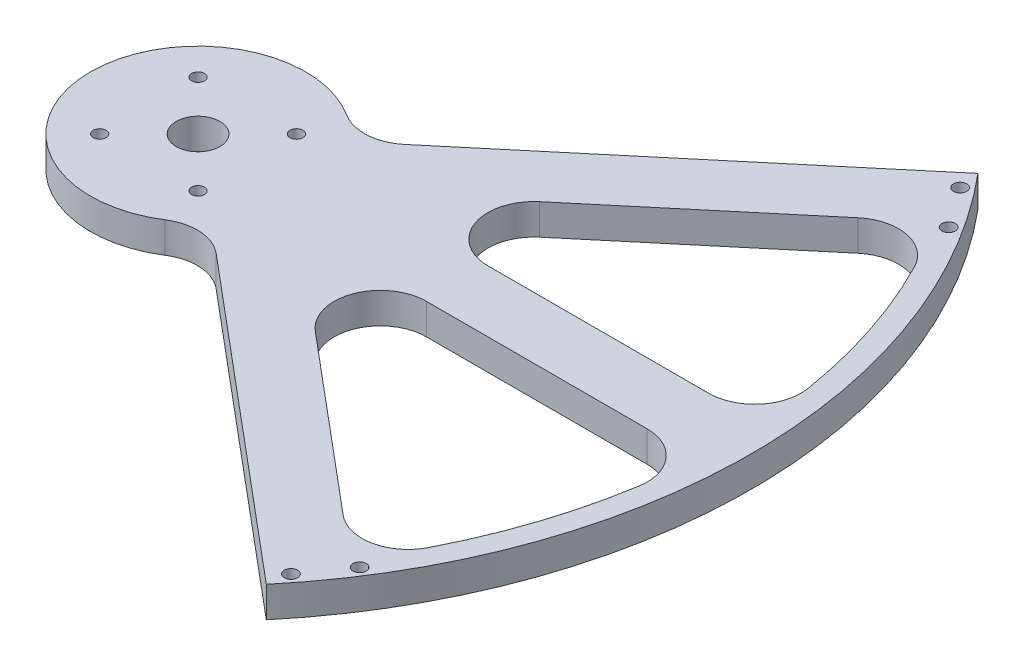
ISO-10303-21;
HEADER;
FILE_DESCRIPTION(('STEP AP214'),'2;1');
FILE_NAME('part.step','',(''),(''),'','','');
FILE_SCHEMA(('AUTOMOTIVE_DESIGN { 1 0 10303 214 1 1 1 1 }'));
ENDSEC;
DATA;
#1=APPLICATION_CONTEXT('core data for automotive mechanical design processes');
#2=APPLICATION_PROTOCOL_DEFINITION('international standard','automotive_design',2000,#1);
#3=PRODUCT_CONTEXT('',#1,'mechanical');
#4=PRODUCT('Part','Part','',(#3));
#5=PRODUCT_RELATED_PRODUCT_CATEGORY('part','',(#4));
#6=PRODUCT_DEFINITION_FORMATION('','',#4);
#7=PRODUCT_DEFINITION_CONTEXT('part definition',#1,'design');
#8=PRODUCT_DEFINITION('design','',#6,#7);
#9=PRODUCT_DEFINITION_SHAPE('','',#8);
#10=(LENGTH_UNIT() NAMED_UNIT(*) SI_UNIT(.MILLI.,.METRE.));
#11=(NAMED_UNIT(*) PLANE_ANGLE_UNIT() SI_UNIT($,.RADIAN.));
#12=(NAMED_UNIT(*) SI_UNIT($,.STERADIAN.) SOLID_ANGLE_UNIT());
#13=UNCERTAINTY_MEASURE_WITH_UNIT(LENGTH_MEASURE(1.E-05),#10,'distance_accuracy_value','');
#14=(GEOMETRIC_REPRESENTATION_CONTEXT(3) GLOBAL_UNCERTAINTY_ASSIGNED_CONTEXT((#13)) GLOBAL_UNIT_ASSIGNED_CONTEXT((#10,
#11,#12)) REPRESENTATION_CONTEXT('',''));
#15=CARTESIAN_POINT('',(0.,0.,0.));
#16=DIRECTION('',(0.,0.,1.));
#17=DIRECTION('',(1.,0.,0.));
#18=AXIS2_PLACEMENT_3D('',#15,#16,#17);
#19=CARTESIAN_POINT('',(74.9376609731613,11.468749366838,147.92195891865));
#20=DIRECTION('',(0.642787609686534,0.,-0.766044443118982));
#21=DIRECTION('',(-0.766044443118982,0.,-0.642787609686534));
#22=AXIS2_PLACEMENT_3D('',#19,#20,#21);
#23=PLANE('',#22);
#24=DIRECTION('',(0.,-1.,0.));
#25=VECTOR('',#24,1.);
#26=CARTESIAN_POINT('',(74.9376609731613,11.468749366838,147.92195891865));
#27=LINE('',#26,#25);
#28=CARTESIAN_POINT('',(74.9376609731613,11.468749366838,147.92195891865));
#29=VERTEX_POINT('',#28);
#30=CARTESIAN_POINT('',(74.9376609731613,1.46874936683801,147.92195891865));
#31=VERTEX_POINT('',#30);
#32=EDGE_CURVE('E196',#29,#31,#27,.T.);
#33=ORIENTED_EDGE('',*,*,#32,.F.);
#34=DIRECTION('',(0.766044443118982,0.,0.642787609686535));
#35=VECTOR('',#34,1.);
#36=CARTESIAN_POINT('',(69.5753498713284,11.468749366838,143.422445650844));
#37=LINE('',#36,#35);
#38=CARTESIAN_POINT('',(-26.412347572315,11.468749366838,62.8792041283273));
#39=VERTEX_POINT('',#38);
#40=EDGE_CURVE('E175',#39,#29,#37,.T.);
#41=ORIENTED_EDGE('',*,*,#40,.F.);
#42=DIRECTION('',(0.,1.,0.));
#43=VECTOR('',#42,1.);
#44=CARTESIAN_POINT('',(-26.412347572315,1.46874936683801,62.8792041283274));
#45=LINE('',#44,#43);
#46=CARTESIAN_POINT('',(-26.412347572315,1.46874936683801,62.8792041283274));
#47=VERTEX_POINT('',#46);
#48=EDGE_CURVE('E259',#39,#47,#45,.F.);
#49=ORIENTED_EDGE('',*,*,#48,.T.);
#50=DIRECTION('',(0.766044443118982,0.,0.642787609686534));
#51=VECTOR('',#50,1.);
#52=CARTESIAN_POINT('',(74.9376609731613,1.46874936683801,147.92195891865));
#53=LINE('',#52,#51);
#54=EDGE_CURVE('E204',#47,#31,#53,.T.);
#55=ORIENTED_EDGE('',*,*,#54,.T.);
#56=EDGE_LOOP('',(#33,#41,#49,#55));
#57=FACE_BOUND('',#56,.T.);
#58=ADVANCED_FACE('F47',(#57),#23,.F.);
#59=CARTESIAN_POINT('',(-62.9503387882554,11.468749366838,32.2201891750733));
#60=DIRECTION('',(0.,-1.,0.));
#61=DIRECTION('',(0.,0.,-1.));
#62=AXIS2_PLACEMENT_3D('',#59,#60,#61);
#63=CYLINDRICAL_SURFACE('',#62,180.);
#64=CARTESIAN_POINT('',(-62.9503387882554,11.468749366838,32.2201891750733));
#65=DIRECTION('',(0.,1.,0.));
#66=DIRECTION('',(0.,0.,1.));
#67=AXIS2_PLACEMENT_3D('',#64,#65,#66);
#68=CIRCLE('',#67,180.);
#69=CARTESIAN_POINT('',(74.9376609731609,11.468749366838,-83.4815805685036));
#70=VERTEX_POINT('',#69);
#71=EDGE_CURVE('E180',#29,#70,#68,.T.);
#72=ORIENTED_EDGE('',*,*,#71,.F.);
#73=ORIENTED_EDGE('',*,*,#32,.T.);
#74=CARTESIAN_POINT('',(-62.9503387882554,1.46874936683801,32.2201891750733));
#75=DIRECTION('',(0.,1.,0.));
#76=DIRECTION('',(0.,0.,1.));
#77=AXIS2_PLACEMENT_3D('',#74,#75,#76);
#78=CIRCLE('',#77,180.);
#79=CARTESIAN_POINT('',(74.9376609731608,1.46874936683801,-83.4815805685036));
#80=VERTEX_POINT('',#79);
#81=EDGE_CURVE('E377',#31,#80,#78,.T.);
#82=ORIENTED_EDGE('',*,*,#81,.T.);
#83=DIRECTION('',(0.,-1.,0.));
#84=VECTOR('',#83,1.);
#85=CARTESIAN_POINT('',(74.9376609731608,11.468749366838,-83.4815805685036));
#86=LINE('',#85,#84);
#87=EDGE_CURVE('E198',#70,#80,#86,.T.);
#88=ORIENTED_EDGE('',*,*,#87,.F.);
#89=EDGE_LOOP('',(#72,#73,#82,#88));
#90=FACE_BOUND('',#89,.T.);
#91=ADVANCED_FACE('F194',(#90),#63,.T.);
#92=CARTESIAN_POINT('',(69.575349871328,11.468749366838,-78.9820673006978));
#93=DIRECTION('',(0.642787609686538,0.,0.766044443118979));
#94=DIRECTION('',(0.766044443118979,0.,-0.642787609686538));
#95=AXIS2_PLACEMENT_3D('',#92,#93,#94);
#96=PLANE('',#95);
#97=DIRECTION('',(-0.766044443118979,0.,0.642787609686539));
#98=VECTOR('',#97,1.);
#99=CARTESIAN_POINT('',(69.575349871328,11.468749366838,-78.9820673006978));
#100=LINE('',#99,#98);
#101=CARTESIAN_POINT('',(-26.4123475723149,11.468749366838,1.56117422181919));
#102=VERTEX_POINT('',#101);
#103=EDGE_CURVE('E190',#70,#102,#100,.T.);
#104=ORIENTED_EDGE('',*,*,#103,.F.);
#105=ORIENTED_EDGE('',*,*,#87,.T.);
#106=DIRECTION('',(-0.766044443118979,0.,0.642787609686538));
#107=VECTOR('',#106,1.);
#108=CARTESIAN_POINT('',(69.575349871328,1.46874936683801,-78.9820673006978));
#109=LINE('',#108,#107);
#110=CARTESIAN_POINT('',(-26.412347572315,1.46874936683801,1.56117422181909));
#111=VERTEX_POINT('',#110);
#112=EDGE_CURVE('E368',#80,#111,#109,.T.);
#113=ORIENTED_EDGE('',*,*,#112,.T.);
#114=DIRECTION('',(0.,1.,0.));
#115=VECTOR('',#114,1.);
#116=CARTESIAN_POINT('',(-26.412347572315,11.468749366838,1.56117422181909));
#117=LINE('',#116,#115);
#118=EDGE_CURVE('E256',#111,#102,#117,.T.);
#119=ORIENTED_EDGE('',*,*,#118,.T.);
#120=EDGE_LOOP('',(#104,#105,#113,#119));
#121=FACE_BOUND('',#120,.T.);
#122=ADVANCED_FACE('F384',(#121),#96,.F.);
#123=CARTESIAN_POINT('',(-62.9503387882554,11.468749366838,32.2201891750733));
#124=DIRECTION('',(0.,-1.,0.));
#125=DIRECTION('',(0.,0.,-1.));
#126=AXIS2_PLACEMENT_3D('',#123,#124,#125);
#127=CYLINDRICAL_SURFACE('',#126,173.);
#128=DIRECTION('',(0.,-1.,0.));
#129=VECTOR('',#128,1.);
#130=CARTESIAN_POINT('',(90.9163006472759,11.468749366838,111.302786937262));
#131=LINE('',#130,#129);
#132=CARTESIAN_POINT('',(90.9163006472759,1.46874936683801,111.302786937262));
#133=VERTEX_POINT('',#132);
#134=CARTESIAN_POINT('',(90.9163006472759,11.468749366838,111.302786937262));
#135=VERTEX_POINT('',#134);
#136=EDGE_CURVE('E220',#133,#135,#131,.F.);
#137=ORIENTED_EDGE('',*,*,#136,.T.);
#138=CARTESIAN_POINT('',(-62.9503387882554,11.468749366838,32.2201891750733));
#139=DIRECTION('',(0.,1.,0.));
#140=DIRECTION('',(0.,0.,1.));
#141=AXIS2_PLACEMENT_3D('',#138,#139,#140);
#142=CIRCLE('',#141,173.);
#143=CARTESIAN_POINT('',(107.870315707163,11.468749366838,59.5936068965922));
#144=VERTEX_POINT('',#143);
#145=EDGE_CURVE('E503',#135,#144,#142,.T.);
#146=ORIENTED_EDGE('',*,*,#145,.T.);
#147=DIRECTION('',(0.,-1.,0.));
#148=VECTOR('',#147,1.);
#149=CARTESIAN_POINT('',(107.870315707163,11.468749366838,59.5936068965922));
#150=LINE('',#149,#148);
#151=CARTESIAN_POINT('',(107.870315707163,1.46874936683801,59.5936068965922));
#152=VERTEX_POINT('',#151);
#153=EDGE_CURVE('E224',#144,#152,#150,.T.);
#154=ORIENTED_EDGE('',*,*,#153,.T.);
#155=CARTESIAN_POINT('',(-62.9503387882554,1.46874936683801,32.2201891750733));
#156=DIRECTION('',(0.,1.,0.));
#157=DIRECTION('',(0.,0.,1.));
#158=AXIS2_PLACEMENT_3D('',#155,#156,#157);
#159=CIRCLE('',#158,173.);
#160=EDGE_CURVE('E423',#133,#152,#159,.T.);
#161=ORIENTED_EDGE('',*,*,#160,.F.);
#162=EDGE_LOOP('',(#137,#146,#154,#161));
#163=FACE_BOUND('',#162,.T.);
#164=ADVANCED_FACE('F514',(#163),#127,.F.);
#165=DIRECTION('',(0.,-1.,0.));
#166=VECTOR('',#165,1.);
#167=CARTESIAN_POINT('',(107.870315707163,11.468749366838,4.84677145355426));
#168=LINE('',#167,#166);
#169=CARTESIAN_POINT('',(107.870315707163,1.46874936683801,4.84677145355426));
#170=VERTEX_POINT('',#169);
#171=CARTESIAN_POINT('',(107.870315707163,11.468749366838,4.84677145355427));
#172=VERTEX_POINT('',#171);
#173=EDGE_CURVE('E212',#170,#172,#168,.F.);
#174=ORIENTED_EDGE('',*,*,#173,.T.);
#175=CARTESIAN_POINT('',(90.9163006472759,11.468749366838,-46.8624085871159));
#176=VERTEX_POINT('',#175);
#177=EDGE_CURVE('E200',#172,#176,#142,.T.);
#178=ORIENTED_EDGE('',*,*,#177,.T.);
#179=DIRECTION('',(0.,-1.,0.));
#180=VECTOR('',#179,1.);
#181=CARTESIAN_POINT('',(90.9163006472759,11.468749366838,-46.8624085871159));
#182=LINE('',#181,#180);
#183=CARTESIAN_POINT('',(90.9163006472759,1.46874936683801,-46.8624085871159));
#184=VERTEX_POINT('',#183);
#185=EDGE_CURVE('E207',#176,#184,#182,.T.);
#186=ORIENTED_EDGE('',*,*,#185,.T.);
#187=CARTESIAN_POINT('',(-62.9503387882554,1.46874936683801,32.2201891750733));
#188=DIRECTION('',(0.,1.,0.));
#189=DIRECTION('',(0.,0.,1.));
#190=AXIS2_PLACEMENT_3D('',#187,#188,#189);
#191=CIRCLE('',#190,173.);
#192=EDGE_CURVE('E317',#170,#184,#191,.T.);
#193=ORIENTED_EDGE('',*,*,#192,.F.);
#194=EDGE_LOOP('',(#174,#178,#186,#193));
#195=FACE_BOUND('',#194,.T.);
#196=ADVANCED_FACE('F501',(#195),#127,.F.);
#197=CARTESIAN_POINT('',(-62.9503387882554,11.468749366838,32.2201891750733));
#198=DIRECTION('',(0.,1.,0.));
#199=DIRECTION('',(0.,0.,1.));
#200=AXIS2_PLACEMENT_3D('',#197,#198,#199);
#201=PLANE('',#200);
#202=CARTESIAN_POINT('',(76.0350849845296,11.468749366838,141.01036326584));
#203=DIRECTION('',(0.,1.,0.));
#204=DIRECTION('',(0.,0.,1.));
#205=AXIS2_PLACEMENT_3D('',#202,#203,#204);
#206=CIRCLE('',#205,2.15);
#207=CARTESIAN_POINT('',(76.0350849845296,11.468749366838,143.16036326584));
#208=VERTEX_POINT('',#207);
#209=EDGE_CURVE('E554',#208,#208,#206,.T.);
#210=ORIENTED_EDGE('',*,*,#209,.F.);
#211=EDGE_LOOP('',(#210));
#212=FACE_BOUND('',#211,.T.);
#213=CARTESIAN_POINT('',(85.3158775813918,11.468749366838,127.977064037555));
#214=DIRECTION('',(0.,1.,0.));
#215=DIRECTION('',(0.,0.,1.));
#216=AXIS2_PLACEMENT_3D('',#213,#214,#215);
#217=CIRCLE('',#216,2.15);
#218=CARTESIAN_POINT('',(85.3158775813918,11.468749366838,130.127064037555));
#219=VERTEX_POINT('',#218);
#220=EDGE_CURVE('E557',#219,#219,#217,.T.);
#221=ORIENTED_EDGE('',*,*,#220,.F.);
#222=EDGE_LOOP('',(#221));
#223=FACE_BOUND('',#222,.T.);
#224=CARTESIAN_POINT('',(85.3158775813918,11.468749366838,-63.5366856874082));
#225=DIRECTION('',(0.,1.,0.));
#226=DIRECTION('',(0.,0.,-1.));
#227=AXIS2_PLACEMENT_3D('',#224,#225,#226);
#228=CIRCLE('',#227,2.15);
#229=CARTESIAN_POINT('',(85.3158775813918,11.468749366838,-65.6866856874082));
#230=VERTEX_POINT('',#229);
#231=EDGE_CURVE('E569',#230,#230,#228,.T.);
#232=ORIENTED_EDGE('',*,*,#231,.F.);
#233=EDGE_LOOP('',(#232));
#234=FACE_BOUND('',#233,.T.);
#235=CARTESIAN_POINT('',(76.0350849845296,11.468749366838,-76.5699849156937));
#236=DIRECTION('',(0.,1.,0.));
#237=DIRECTION('',(0.,0.,-1.));
#238=AXIS2_PLACEMENT_3D('',#235,#236,#237);
#239=CIRCLE('',#238,2.15);
#240=CARTESIAN_POINT('',(76.0350849845296,11.468749366838,-78.7199849156937));
#241=VERTEX_POINT('',#240);
#242=EDGE_CURVE('E577',#241,#241,#239,.T.);
#243=ORIENTED_EDGE('',*,*,#242,.F.);
#244=EDGE_LOOP('',(#243));
#245=FACE_BOUND('',#244,.T.);
#246=ORIENTED_EDGE('',*,*,#40,.T.);
#247=ORIENTED_EDGE('',*,*,#71,.T.);
#248=ORIENTED_EDGE('',*,*,#103,.T.);
#249=CARTESIAN_POINT('',(-36.0541617176131,11.468749366838,-9.92949242496559));
#250=DIRECTION('',(0.,1.,0.));
#251=DIRECTION('',(0.,0.,1.));
#252=AXIS2_PLACEMENT_3D('',#249,#250,#251);
#253=CIRCLE('',#252,15.);
#254=CARTESIAN_POINT('',(-44.1230148388058,11.468749366838,2.71541205504606));
#255=VERTEX_POINT('',#254);
#256=EDGE_CURVE('E290',#102,#255,#253,.F.);
#257=ORIENTED_EDGE('',*,*,#256,.T.);
#258=CARTESIAN_POINT('',(-62.9503387882554,11.468749366838,32.2201891750733));
#259=DIRECTION('',(0.,1.,0.));
#260=DIRECTION('',(0.,0.,1.));
#261=AXIS2_PLACEMENT_3D('',#258,#259,#260);
#262=CIRCLE('',#261,35.);
#263=CARTESIAN_POINT('',(-44.1230148388058,11.468749366838,61.7249662951005));
#264=VERTEX_POINT('',#263);
#265=EDGE_CURVE('E191',#255,#264,#262,.T.);
#266=ORIENTED_EDGE('',*,*,#265,.T.);
#267=CARTESIAN_POINT('',(-36.0541617176131,11.468749366838,74.3698707751121));
#268=DIRECTION('',(0.,1.,0.));
#269=DIRECTION('',(0.,0.,1.));
#270=AXIS2_PLACEMENT_3D('',#267,#268,#269);
#271=CIRCLE('',#270,15.);
#272=EDGE_CURVE('E184',#264,#39,#271,.F.);
#273=ORIENTED_EDGE('',*,*,#272,.T.);
#274=EDGE_LOOP('',(#246,#247,#248,#257,#266,#273));
#275=FACE_BOUND('',#274,.T.);
#276=CARTESIAN_POINT('',(93.0592763000461,11.468749366838,57.2201891750733));
#277=DIRECTION('',(0.,1.,0.));
#278=DIRECTION('',(0.,0.,1.));
#279=AXIS2_PLACEMENT_3D('',#276,#277,#278);
#280=CIRCLE('',#279,15.);
#281=CARTESIAN_POINT('',(93.0592763000461,11.468749366838,42.2201891750733));
#282=VERTEX_POINT('',#281);
#283=EDGE_CURVE('E271',#282,#144,#280,.F.);
#284=ORIENTED_EDGE('',*,*,#283,.T.);
#285=ORIENTED_EDGE('',*,*,#145,.F.);
#286=CARTESIAN_POINT('',(77.5752625459293,11.468749366838,104.445914298922));
#287=DIRECTION('',(0.,1.,0.));
#288=DIRECTION('',(0.,0.,1.));
#289=AXIS2_PLACEMENT_3D('',#286,#287,#288);
#290=CIRCLE('',#289,15.);
#291=CARTESIAN_POINT('',(67.9334484006312,11.468749366838,115.936580945707));
#292=VERTEX_POINT('',#291);
#293=EDGE_CURVE('E278',#135,#292,#290,.F.);
#294=ORIENTED_EDGE('',*,*,#293,.T.);
#295=DIRECTION('',(0.766044443118982,0.,0.642787609686535));
#296=VECTOR('',#295,1.);
#297=CARTESIAN_POINT('',(81.5425226078713,11.468749366838,127.355950093666));
#298=LINE('',#297,#296);
#299=CARTESIAN_POINT('',(11.6520208214168,11.468749366838,68.710855821858));
#300=VERTEX_POINT('',#299);
#301=EDGE_CURVE('E421',#300,#292,#298,.T.);
#302=ORIENTED_EDGE('',*,*,#301,.F.);
#303=CARTESIAN_POINT('',(21.2938349667149,11.468749366838,57.2201891750733));
#304=DIRECTION('',(0.,1.,0.));
#305=DIRECTION('',(0.,0.,1.));
#306=AXIS2_PLACEMENT_3D('',#303,#304,#305);
#307=CIRCLE('',#306,15.);
#308=CARTESIAN_POINT('',(21.2938349667149,11.468749366838,42.2201891750733));
#309=VERTEX_POINT('',#308);
#310=EDGE_CURVE('E301',#300,#309,#307,.F.);
#311=ORIENTED_EDGE('',*,*,#310,.T.);
#312=DIRECTION('',(-1.,0.,0.));
#313=VECTOR('',#312,1.);
#314=CARTESIAN_POINT('',(-19.9183263251048,11.468749366838,42.2201891750733));
#315=LINE('',#314,#313);
#316=EDGE_CURVE('E415',#282,#309,#315,.T.);
#317=ORIENTED_EDGE('',*,*,#316,.F.);
#318=EDGE_LOOP('',(#284,#285,#294,#302,#311,#317));
#319=FACE_BOUND('',#318,.T.);
#320=CARTESIAN_POINT('',(-78.9503387882554,11.468749366838,16.2201891750733));
#321=DIRECTION('',(0.,1.,0.));
#322=DIRECTION('',(0.,0.,1.));
#323=AXIS2_PLACEMENT_3D('',#320,#321,#322);
#324=CIRCLE('',#323,2.1);
#325=CARTESIAN_POINT('',(-78.9503387882554,11.468749366838,18.3201891750732));
#326=VERTEX_POINT('',#325);
#327=EDGE_CURVE('E427',#326,#326,#324,.T.);
#328=ORIENTED_EDGE('',*,*,#327,.F.);
#329=EDGE_LOOP('',(#328));
#330=FACE_BOUND('',#329,.T.);
#331=CARTESIAN_POINT('',(-46.9503387882554,11.468749366838,48.2201891750733));
#332=DIRECTION('',(0.,1.,0.));
#333=DIRECTION('',(0.,0.,1.));
#334=AXIS2_PLACEMENT_3D('',#331,#332,#333);
#335=CIRCLE('',#334,2.1);
#336=CARTESIAN_POINT('',(-46.9503387882554,11.468749366838,50.3201891750733));
#337=VERTEX_POINT('',#336);
#338=EDGE_CURVE('E343',#337,#337,#335,.T.);
#339=ORIENTED_EDGE('',*,*,#338,.F.);
#340=EDGE_LOOP('',(#339));
#341=FACE_BOUND('',#340,.T.);
#342=CARTESIAN_POINT('',(-62.9503387882554,11.468749366838,32.2201891750733));
#343=DIRECTION('',(0.,1.,0.));
#344=DIRECTION('',(0.,0.,1.));
#345=AXIS2_PLACEMENT_3D('',#342,#343,#344);
#346=CIRCLE('',#345,7.1);
#347=CARTESIAN_POINT('',(-62.9503387882554,11.468749366838,39.3201891750733));
#348=VERTEX_POINT('',#347);
#349=EDGE_CURVE('E359',#348,#348,#346,.T.);
#350=ORIENTED_EDGE('',*,*,#349,.F.);
#351=EDGE_LOOP('',(#350));
#352=FACE_BOUND('',#351,.T.);
#353=CARTESIAN_POINT('',(-78.9503387882554,11.468749366838,48.2201891750733));
#354=DIRECTION('',(0.,1.,0.));
#355=DIRECTION('',(0.,0.,1.));
#356=AXIS2_PLACEMENT_3D('',#353,#354,#355);
#357=CIRCLE('',#356,2.1);
#358=CARTESIAN_POINT('',(-78.9503387882554,11.468749366838,50.3201891750733));
#359=VERTEX_POINT('',#358);
#360=EDGE_CURVE('E351',#359,#359,#357,.T.);
#361=ORIENTED_EDGE('',*,*,#360,.F.);
#362=EDGE_LOOP('',(#361));
#363=FACE_BOUND('',#362,.T.);
#364=CARTESIAN_POINT('',(-46.9503387882554,11.468749366838,16.2201891750733));
#365=DIRECTION('',(0.,1.,0.));
#366=DIRECTION('',(0.,0.,1.));
#367=AXIS2_PLACEMENT_3D('',#364,#365,#366);
#368=CIRCLE('',#367,2.1);
#369=CARTESIAN_POINT('',(-46.9503387882554,11.468749366838,18.3201891750733));
#370=VERTEX_POINT('',#369);
#371=EDGE_CURVE('E341',#370,#370,#368,.T.);
#372=ORIENTED_EDGE('',*,*,#371,.F.);
#373=EDGE_LOOP('',(#372));
#374=FACE_BOUND('',#373,.T.);
#375=CARTESIAN_POINT('',(77.5752625459292,11.468749366838,-40.0055359487757));
#376=DIRECTION('',(0.,1.,0.));
#377=DIRECTION('',(0.,0.,1.));
#378=AXIS2_PLACEMENT_3D('',#375,#376,#377);
#379=CIRCLE('',#378,15.);
#380=CARTESIAN_POINT('',(67.9334484006312,11.468749366838,-51.4962025955605));
#381=VERTEX_POINT('',#380);
#382=EDGE_CURVE('E11',#381,#176,#379,.F.);
#383=ORIENTED_EDGE('',*,*,#382,.T.);
#384=ORIENTED_EDGE('',*,*,#177,.F.);
#385=CARTESIAN_POINT('',(93.0592763000461,11.468749366838,7.22018917507326));
#386=DIRECTION('',(0.,1.,0.));
#387=DIRECTION('',(0.,0.,1.));
#388=AXIS2_PLACEMENT_3D('',#385,#386,#387);
#389=CIRCLE('',#388,15.);
#390=CARTESIAN_POINT('',(93.0592763000461,11.468749366838,22.2201891750733));
#391=VERTEX_POINT('',#390);
#392=EDGE_CURVE('E284',#172,#391,#389,.F.);
#393=ORIENTED_EDGE('',*,*,#392,.T.);
#394=DIRECTION('',(1.,0.,0.));
#395=VECTOR('',#394,1.);
#396=CARTESIAN_POINT('',(-19.9183263251046,11.468749366838,22.2201891750732));
#397=LINE('',#396,#395);
#398=CARTESIAN_POINT('',(21.293834966715,11.468749366838,22.2201891750732));
#399=VERTEX_POINT('',#398);
#400=EDGE_CURVE('E328',#399,#391,#397,.T.);
#401=ORIENTED_EDGE('',*,*,#400,.F.);
#402=CARTESIAN_POINT('',(21.293834966715,11.468749366838,7.22018917507325));
#403=DIRECTION('',(0.,1.,0.));
#404=DIRECTION('',(0.,0.,1.));
#405=AXIS2_PLACEMENT_3D('',#402,#403,#404);
#406=CIRCLE('',#405,15.);
#407=CARTESIAN_POINT('',(11.6520208214169,11.468749366838,-4.27047747171144));
#408=VERTEX_POINT('',#407);
#409=EDGE_CURVE('E63',#399,#408,#406,.F.);
#410=ORIENTED_EDGE('',*,*,#409,.T.);
#411=DIRECTION('',(-0.766044443118981,0.,0.642787609686536));
#412=VECTOR('',#411,1.);
#413=CARTESIAN_POINT('',(81.5425226078714,11.468749366838,-62.9155717435198));
#414=LINE('',#413,#412);
#415=EDGE_CURVE('E326',#381,#408,#414,.T.);
#416=ORIENTED_EDGE('',*,*,#415,.F.);
#417=EDGE_LOOP('',(#383,#384,#393,#401,#410,#416));
#418=FACE_BOUND('',#417,.T.);
#419=ADVANCED_FACE('F177',(#212,#223,#234,#245,#275,#319,#330,#341,#352,#363,#374,#418),#201,.T.);
#420=CARTESIAN_POINT('',(-62.9503387882554,1.46874936683801,32.2201891750733));
#421=DIRECTION('',(0.,1.,0.));
#422=DIRECTION('',(0.,0.,1.));
#423=AXIS2_PLACEMENT_3D('',#420,#421,#422);
#424=PLANE('',#423);
#425=CARTESIAN_POINT('',(76.0350849845296,1.46874936683801,141.01036326584));
#426=DIRECTION('',(0.,1.,0.));
#427=DIRECTION('',(0.,0.,1.));
#428=AXIS2_PLACEMENT_3D('',#425,#426,#427);
#429=CIRCLE('',#428,2.15);
#430=CARTESIAN_POINT('',(76.0350849845296,1.46874936683801,143.16036326584));
#431=VERTEX_POINT('',#430);
#432=EDGE_CURVE('E201',#431,#431,#429,.T.);
#433=ORIENTED_EDGE('',*,*,#432,.T.);
#434=EDGE_LOOP('',(#433));
#435=FACE_BOUND('',#434,.T.);
#436=CARTESIAN_POINT('',(85.3158775813918,1.46874936683801,127.977064037555));
#437=DIRECTION('',(0.,1.,0.));
#438=DIRECTION('',(0.,0.,1.));
#439=AXIS2_PLACEMENT_3D('',#436,#437,#438);
#440=CIRCLE('',#439,2.15);
#441=CARTESIAN_POINT('',(85.3158775813918,1.46874936683801,130.127064037555));
#442=VERTEX_POINT('',#441);
#443=EDGE_CURVE('E563',#442,#442,#440,.T.);
#444=ORIENTED_EDGE('',*,*,#443,.T.);
#445=EDGE_LOOP('',(#444));
#446=FACE_BOUND('',#445,.T.);
#447=CARTESIAN_POINT('',(85.3158775813918,1.46874936683801,-63.5366856874082));
#448=DIRECTION('',(0.,1.,0.));
#449=DIRECTION('',(0.,0.,-1.));
#450=AXIS2_PLACEMENT_3D('',#447,#448,#449);
#451=CIRCLE('',#450,2.15);
#452=CARTESIAN_POINT('',(85.3158775813918,1.46874936683801,-65.6866856874082));
#453=VERTEX_POINT('',#452);
#454=EDGE_CURVE('E573',#453,#453,#451,.T.);
#455=ORIENTED_EDGE('',*,*,#454,.T.);
#456=EDGE_LOOP('',(#455));
#457=FACE_BOUND('',#456,.T.);
#458=CARTESIAN_POINT('',(76.0350849845296,1.46874936683801,-76.5699849156937));
#459=DIRECTION('',(0.,1.,0.));
#460=DIRECTION('',(0.,0.,-1.));
#461=AXIS2_PLACEMENT_3D('',#458,#459,#460);
#462=CIRCLE('',#461,2.15);
#463=CARTESIAN_POINT('',(76.0350849845296,1.46874936683801,-78.7199849156937));
#464=VERTEX_POINT('',#463);
#465=EDGE_CURVE('E580',#464,#464,#462,.T.);
#466=ORIENTED_EDGE('',*,*,#465,.T.);
#467=EDGE_LOOP('',(#466));
#468=FACE_BOUND('',#467,.T.);
#469=CARTESIAN_POINT('',(-78.9503387882554,1.46874936683801,16.2201891750733));
#470=DIRECTION('',(0.,1.,0.));
#471=DIRECTION('',(0.,0.,1.));
#472=AXIS2_PLACEMENT_3D('',#469,#470,#471);
#473=CIRCLE('',#472,2.1);
#474=CARTESIAN_POINT('',(-78.9503387882554,1.46874936683801,18.3201891750732));
#475=VERTEX_POINT('',#474);
#476=EDGE_CURVE('E431',#475,#475,#473,.T.);
#477=ORIENTED_EDGE('',*,*,#476,.T.);
#478=EDGE_LOOP('',(#477));
#479=FACE_BOUND('',#478,.T.);
#480=CARTESIAN_POINT('',(-46.9503387882554,1.46874936683801,16.2201891750733));
#481=DIRECTION('',(0.,1.,0.));
#482=DIRECTION('',(0.,0.,1.));
#483=AXIS2_PLACEMENT_3D('',#480,#481,#482);
#484=CIRCLE('',#483,2.1);
#485=CARTESIAN_POINT('',(-46.9503387882554,1.46874936683801,18.3201891750733));
#486=VERTEX_POINT('',#485);
#487=EDGE_CURVE('E337',#486,#486,#484,.T.);
#488=ORIENTED_EDGE('',*,*,#487,.T.);
#489=EDGE_LOOP('',(#488));
#490=FACE_BOUND('',#489,.T.);
#491=DIRECTION('',(1.,0.,0.));
#492=VECTOR('',#491,1.);
#493=CARTESIAN_POINT('',(-19.9183263251046,1.46874936683801,22.2201891750732));
#494=LINE('',#493,#492);
#495=CARTESIAN_POINT('',(21.293834966715,1.46874936683801,22.2201891750732));
#496=VERTEX_POINT('',#495);
#497=CARTESIAN_POINT('',(93.0592763000461,1.46874936683801,22.2201891750733));
#498=VERTEX_POINT('',#497);
#499=EDGE_CURVE('E323',#496,#498,#494,.T.);
#500=ORIENTED_EDGE('',*,*,#499,.T.);
#501=CARTESIAN_POINT('',(93.0592763000461,1.46874936683801,7.22018917507326));
#502=DIRECTION('',(0.,1.,0.));
#503=DIRECTION('',(0.,0.,1.));
#504=AXIS2_PLACEMENT_3D('',#501,#502,#503);
#505=CIRCLE('',#504,15.);
#506=EDGE_CURVE('E281',#498,#170,#505,.T.);
#507=ORIENTED_EDGE('',*,*,#506,.T.);
#508=ORIENTED_EDGE('',*,*,#192,.T.);
#509=CARTESIAN_POINT('',(77.5752625459292,1.46874936683801,-40.0055359487757));
#510=DIRECTION('',(0.,1.,0.));
#511=DIRECTION('',(0.,0.,1.));
#512=AXIS2_PLACEMENT_3D('',#509,#510,#511);
#513=CIRCLE('',#512,15.);
#514=CARTESIAN_POINT('',(67.9334484006312,1.46874936683801,-51.4962025955605));
#515=VERTEX_POINT('',#514);
#516=EDGE_CURVE('E56',#184,#515,#513,.T.);
#517=ORIENTED_EDGE('',*,*,#516,.T.);
#518=DIRECTION('',(-0.766044443118981,0.,0.642787609686536));
#519=VECTOR('',#518,1.);
#520=CARTESIAN_POINT('',(81.5425226078714,1.46874936683801,-62.9155717435198));
#521=LINE('',#520,#519);
#522=CARTESIAN_POINT('',(11.6520208214169,1.46874936683801,-4.27047747171144));
#523=VERTEX_POINT('',#522);
#524=EDGE_CURVE('E315',#515,#523,#521,.T.);
#525=ORIENTED_EDGE('',*,*,#524,.T.);
#526=CARTESIAN_POINT('',(21.293834966715,1.46874936683801,7.22018917507325));
#527=DIRECTION('',(0.,1.,0.));
#528=DIRECTION('',(0.,0.,1.));
#529=AXIS2_PLACEMENT_3D('',#526,#527,#528);
#530=CIRCLE('',#529,15.);
#531=EDGE_CURVE('E304',#523,#496,#530,.T.);
#532=ORIENTED_EDGE('',*,*,#531,.T.);
#533=EDGE_LOOP('',(#500,#507,#508,#517,#525,#532));
#534=FACE_BOUND('',#533,.T.);
#535=CARTESIAN_POINT('',(-62.9503387882554,1.46874936683801,32.2201891750733));
#536=DIRECTION('',(0.,1.,0.));
#537=DIRECTION('',(0.,0.,1.));
#538=AXIS2_PLACEMENT_3D('',#535,#536,#537);
#539=CIRCLE('',#538,35.);
#540=CARTESIAN_POINT('',(-44.1230148388058,1.46874936683801,2.71541205504606));
#541=VERTEX_POINT('',#540);
#542=CARTESIAN_POINT('',(-44.1230148388058,1.46874936683801,61.7249662951005));
#543=VERTEX_POINT('',#542);
#544=EDGE_CURVE('E363',#541,#543,#539,.T.);
#545=ORIENTED_EDGE('',*,*,#544,.F.);
#546=CARTESIAN_POINT('',(-36.0541617176131,1.46874936683801,-9.92949242496559));
#547=DIRECTION('',(0.,1.,0.));
#548=DIRECTION('',(0.,0.,1.));
#549=AXIS2_PLACEMENT_3D('',#546,#547,#548);
#550=CIRCLE('',#549,15.);
#551=EDGE_CURVE('E287',#541,#111,#550,.T.);
#552=ORIENTED_EDGE('',*,*,#551,.T.);
#553=ORIENTED_EDGE('',*,*,#112,.F.);
#554=ORIENTED_EDGE('',*,*,#81,.F.);
#555=ORIENTED_EDGE('',*,*,#54,.F.);
#556=CARTESIAN_POINT('',(-36.0541617176131,1.46874936683801,74.3698707751121));
#557=DIRECTION('',(0.,1.,0.));
#558=DIRECTION('',(0.,0.,1.));
#559=AXIS2_PLACEMENT_3D('',#556,#557,#558);
#560=CIRCLE('',#559,15.);
#561=EDGE_CURVE('E293',#47,#543,#560,.T.);
#562=ORIENTED_EDGE('',*,*,#561,.T.);
#563=EDGE_LOOP('',(#545,#552,#553,#554,#555,#562));
#564=FACE_BOUND('',#563,.T.);
#565=CARTESIAN_POINT('',(-62.9503387882554,1.46874936683801,32.2201891750733));
#566=DIRECTION('',(0.,1.,0.));
#567=DIRECTION('',(0.,0.,1.));
#568=AXIS2_PLACEMENT_3D('',#565,#566,#567);
#569=CIRCLE('',#568,7.1);
#570=CARTESIAN_POINT('',(-62.9503387882554,1.46874936683801,39.3201891750733));
#571=VERTEX_POINT('',#570);
#572=EDGE_CURVE('E355',#571,#571,#569,.T.);
#573=ORIENTED_EDGE('',*,*,#572,.T.);
#574=EDGE_LOOP('',(#573));
#575=FACE_BOUND('',#574,.T.);
#576=CARTESIAN_POINT('',(-78.9503387882554,1.46874936683801,48.2201891750733));
#577=DIRECTION('',(0.,1.,0.));
#578=DIRECTION('',(0.,0.,1.));
#579=AXIS2_PLACEMENT_3D('',#576,#577,#578);
#580=CIRCLE('',#579,2.1);
#581=CARTESIAN_POINT('',(-78.9503387882554,1.46874936683801,50.3201891750733));
#582=VERTEX_POINT('',#581);
#583=EDGE_CURVE('E347',#582,#582,#580,.T.);
#584=ORIENTED_EDGE('',*,*,#583,.T.);
#585=EDGE_LOOP('',(#584));
#586=FACE_BOUND('',#585,.T.);
#587=CARTESIAN_POINT('',(-46.9503387882554,1.46874936683801,48.2201891750733));
#588=DIRECTION('',(0.,1.,0.));
#589=DIRECTION('',(0.,0.,1.));
#590=AXIS2_PLACEMENT_3D('',#587,#588,#589);
#591=CIRCLE('',#590,2.1);
#592=CARTESIAN_POINT('',(-46.9503387882554,1.46874936683801,50.3201891750733));
#593=VERTEX_POINT('',#592);
#594=EDGE_CURVE('E333',#593,#593,#591,.T.);
#595=ORIENTED_EDGE('',*,*,#594,.T.);
#596=EDGE_LOOP('',(#595));
#597=FACE_BOUND('',#596,.T.);
#598=DIRECTION('',(0.766044443118982,0.,0.642787609686535));
#599=VECTOR('',#598,1.);
#600=CARTESIAN_POINT('',(81.5425226078713,1.46874936683801,127.355950093666));
#601=LINE('',#600,#599);
#602=CARTESIAN_POINT('',(11.6520208214168,1.46874936683801,68.710855821858));
#603=VERTEX_POINT('',#602);
#604=CARTESIAN_POINT('',(67.9334484006312,1.46874936683801,115.936580945707));
#605=VERTEX_POINT('',#604);
#606=EDGE_CURVE('E408',#603,#605,#601,.T.);
#607=ORIENTED_EDGE('',*,*,#606,.T.);
#608=CARTESIAN_POINT('',(77.5752625459293,1.46874936683801,104.445914298922));
#609=DIRECTION('',(0.,1.,0.));
#610=DIRECTION('',(0.,0.,1.));
#611=AXIS2_PLACEMENT_3D('',#608,#609,#610);
#612=CIRCLE('',#611,15.);
#613=EDGE_CURVE('E275',#605,#133,#612,.T.);
#614=ORIENTED_EDGE('',*,*,#613,.T.);
#615=ORIENTED_EDGE('',*,*,#160,.T.);
#616=CARTESIAN_POINT('',(93.0592763000461,1.46874936683801,57.2201891750733));
#617=DIRECTION('',(0.,1.,0.));
#618=DIRECTION('',(0.,0.,1.));
#619=AXIS2_PLACEMENT_3D('',#616,#617,#618);
#620=CIRCLE('',#619,15.);
#621=CARTESIAN_POINT('',(93.0592763000461,1.46874936683801,42.2201891750733));
#622=VERTEX_POINT('',#621);
#623=EDGE_CURVE('E268',#152,#622,#620,.T.);
#624=ORIENTED_EDGE('',*,*,#623,.T.);
#625=DIRECTION('',(-1.,0.,0.));
#626=VECTOR('',#625,1.);
#627=CARTESIAN_POINT('',(-19.9183263251048,1.46874936683801,42.2201891750733));
#628=LINE('',#627,#626);
#629=CARTESIAN_POINT('',(21.2938349667149,1.46874936683801,42.2201891750733));
#630=VERTEX_POINT('',#629);
#631=EDGE_CURVE('E416',#622,#630,#628,.T.);
#632=ORIENTED_EDGE('',*,*,#631,.T.);
#633=CARTESIAN_POINT('',(21.2938349667149,1.46874936683801,57.2201891750733));
#634=DIRECTION('',(0.,1.,0.));
#635=DIRECTION('',(0.,0.,1.));
#636=AXIS2_PLACEMENT_3D('',#633,#634,#635);
#637=CIRCLE('',#636,15.);
#638=EDGE_CURVE('E298',#630,#603,#637,.T.);
#639=ORIENTED_EDGE('',*,*,#638,.T.);
#640=EDGE_LOOP('',(#607,#614,#615,#624,#632,#639));
#641=FACE_BOUND('',#640,.T.);
#642=ADVANCED_FACE('F313',(#435,#446,#457,#468,#479,#490,#534,#564,#575,#586,#597,#641),#424,.F.);
#643=CARTESIAN_POINT('',(-62.9503387882554,11.468749366838,32.2201891750733));
#644=DIRECTION('',(0.,-1.,0.));
#645=DIRECTION('',(0.,0.,-1.));
#646=AXIS2_PLACEMENT_3D('',#643,#644,#645);
#647=CYLINDRICAL_SURFACE('',#646,35.);
#648=ORIENTED_EDGE('',*,*,#265,.F.);
#649=DIRECTION('',(0.,-1.,0.));
#650=VECTOR('',#649,1.);
#651=CARTESIAN_POINT('',(-44.1230148388058,11.468749366838,2.71541205504606));
#652=LINE('',#651,#650);
#653=EDGE_CURVE('E252',#255,#541,#652,.T.);
#654=ORIENTED_EDGE('',*,*,#653,.T.);
#655=ORIENTED_EDGE('',*,*,#544,.T.);
#656=DIRECTION('',(0.,-1.,0.));
#657=VECTOR('',#656,1.);
#658=CARTESIAN_POINT('',(-44.1230148388058,11.468749366838,61.7249662951005));
#659=LINE('',#658,#657);
#660=EDGE_CURVE('E249',#543,#264,#659,.F.);
#661=ORIENTED_EDGE('',*,*,#660,.T.);
#662=EDGE_LOOP('',(#648,#654,#655,#661));
#663=FACE_BOUND('',#662,.T.);
#664=ADVANCED_FACE('F391',(#663),#647,.T.);
#665=CARTESIAN_POINT('',(-62.9503387882554,11.468749366838,32.2201891750733));
#666=DIRECTION('',(0.,-1.,0.));
#667=DIRECTION('',(0.,0.,-1.));
#668=AXIS2_PLACEMENT_3D('',#665,#666,#667);
#669=CYLINDRICAL_SURFACE('',#668,7.1);
#670=ORIENTED_EDGE('',*,*,#349,.T.);
#671=EDGE_LOOP('',(#670));
#672=FACE_BOUND('',#671,.T.);
#673=ORIENTED_EDGE('',*,*,#572,.F.);
#674=EDGE_LOOP('',(#673));
#675=FACE_BOUND('',#674,.T.);
#676=ADVANCED_FACE('F468',(#672,#675),#669,.F.);
#677=CARTESIAN_POINT('',(-78.9503387882554,11.468749366838,48.2201891750733));
#678=DIRECTION('',(0.,-1.,0.));
#679=DIRECTION('',(0.,0.,-1.));
#680=AXIS2_PLACEMENT_3D('',#677,#678,#679);
#681=CYLINDRICAL_SURFACE('',#680,2.1);
#682=ORIENTED_EDGE('',*,*,#360,.T.);
#683=EDGE_LOOP('',(#682));
#684=FACE_BOUND('',#683,.T.);
#685=ORIENTED_EDGE('',*,*,#583,.F.);
#686=EDGE_LOOP('',(#685));
#687=FACE_BOUND('',#686,.T.);
#688=ADVANCED_FACE('F608',(#684,#687),#681,.F.);
#689=CARTESIAN_POINT('',(-46.9503387882554,11.468749366838,48.2201891750733));
#690=DIRECTION('',(0.,-1.,0.));
#691=DIRECTION('',(0.,0.,-1.));
#692=AXIS2_PLACEMENT_3D('',#689,#690,#691);
#693=CYLINDRICAL_SURFACE('',#692,2.1);
#694=ORIENTED_EDGE('',*,*,#338,.T.);
#695=EDGE_LOOP('',(#694));
#696=FACE_BOUND('',#695,.T.);
#697=ORIENTED_EDGE('',*,*,#594,.F.);
#698=EDGE_LOOP('',(#697));
#699=FACE_BOUND('',#698,.T.);
#700=ADVANCED_FACE('F606',(#696,#699),#693,.F.);
#701=CARTESIAN_POINT('',(81.5425226078714,11.468749366838,-62.9155717435198));
#702=DIRECTION('',(0.642787609686536,0.,0.766044443118981));
#703=DIRECTION('',(0.766044443118981,0.,-0.642787609686536));
#704=AXIS2_PLACEMENT_3D('',#701,#702,#703);
#705=PLANE('',#704);
#706=ORIENTED_EDGE('',*,*,#415,.T.);
#707=DIRECTION('',(0.,-1.,0.));
#708=VECTOR('',#707,1.);
#709=CARTESIAN_POINT('',(11.6520208214169,1.46874936683801,-4.27047747171146));
#710=LINE('',#709,#708);
#711=EDGE_CURVE('E264',#408,#523,#710,.T.);
#712=ORIENTED_EDGE('',*,*,#711,.T.);
#713=ORIENTED_EDGE('',*,*,#524,.F.);
#714=DIRECTION('',(0.,1.,0.));
#715=VECTOR('',#714,1.);
#716=CARTESIAN_POINT('',(67.9334484006312,11.468749366838,-51.4962025955605));
#717=LINE('',#716,#715);
#718=EDGE_CURVE('E70',#515,#381,#717,.T.);
#719=ORIENTED_EDGE('',*,*,#718,.T.);
#720=EDGE_LOOP('',(#706,#712,#713,#719));
#721=FACE_BOUND('',#720,.T.);
#722=ADVANCED_FACE('F320',(#721),#705,.T.);
#723=CARTESIAN_POINT('',(-19.9183263251046,11.468749366838,22.2201891750732));
#724=DIRECTION('',(0.,0.,-1.));
#725=DIRECTION('',(-1.,0.,0.));
#726=AXIS2_PLACEMENT_3D('',#723,#724,#725);
#727=PLANE('',#726);
#728=ORIENTED_EDGE('',*,*,#400,.T.);
#729=DIRECTION('',(0.,1.,0.));
#730=VECTOR('',#729,1.);
#731=CARTESIAN_POINT('',(93.0592763000461,1.46874936683801,22.2201891750733));
#732=LINE('',#731,#730);
#733=EDGE_CURVE('E245',#391,#498,#732,.F.);
#734=ORIENTED_EDGE('',*,*,#733,.T.);
#735=ORIENTED_EDGE('',*,*,#499,.F.);
#736=DIRECTION('',(0.,-1.,0.));
#737=VECTOR('',#736,1.);
#738=CARTESIAN_POINT('',(21.293834966715,11.468749366838,22.2201891750732));
#739=LINE('',#738,#737);
#740=EDGE_CURVE('E242',#496,#399,#739,.F.);
#741=ORIENTED_EDGE('',*,*,#740,.T.);
#742=EDGE_LOOP('',(#728,#734,#735,#741));
#743=FACE_BOUND('',#742,.T.);
#744=ADVANCED_FACE('F446',(#743),#727,.T.);
#745=CARTESIAN_POINT('',(-46.9503387882554,11.468749366838,16.2201891750733));
#746=DIRECTION('',(0.,-1.,0.));
#747=DIRECTION('',(0.,0.,-1.));
#748=AXIS2_PLACEMENT_3D('',#745,#746,#747);
#749=CYLINDRICAL_SURFACE('',#748,2.1);
#750=ORIENTED_EDGE('',*,*,#371,.T.);
#751=EDGE_LOOP('',(#750));
#752=FACE_BOUND('',#751,.T.);
#753=ORIENTED_EDGE('',*,*,#487,.F.);
#754=EDGE_LOOP('',(#753));
#755=FACE_BOUND('',#754,.T.);
#756=ADVANCED_FACE('F443',(#752,#755),#749,.F.);
#757=CARTESIAN_POINT('',(-78.9503387882554,11.468749366838,16.2201891750733));
#758=DIRECTION('',(0.,-1.,0.));
#759=DIRECTION('',(0.,0.,-1.));
#760=AXIS2_PLACEMENT_3D('',#757,#758,#759);
#761=CYLINDRICAL_SURFACE('',#760,2.1);
#762=ORIENTED_EDGE('',*,*,#327,.T.);
#763=EDGE_LOOP('',(#762));
#764=FACE_BOUND('',#763,.T.);
#765=ORIENTED_EDGE('',*,*,#476,.F.);
#766=EDGE_LOOP('',(#765));
#767=FACE_BOUND('',#766,.T.);
#768=ADVANCED_FACE('F445',(#764,#767),#761,.F.);
#769=CARTESIAN_POINT('',(-19.9183263251048,11.468749366838,42.2201891750733));
#770=DIRECTION('',(0.,0.,1.));
#771=DIRECTION('',(1.,0.,0.));
#772=AXIS2_PLACEMENT_3D('',#769,#770,#771);
#773=PLANE('',#772);
#774=ORIENTED_EDGE('',*,*,#631,.F.);
#775=DIRECTION('',(0.,1.,0.));
#776=VECTOR('',#775,1.);
#777=CARTESIAN_POINT('',(93.0592763000461,11.468749366838,42.2201891750733));
#778=LINE('',#777,#776);
#779=EDGE_CURVE('E232',#622,#282,#778,.T.);
#780=ORIENTED_EDGE('',*,*,#779,.T.);
#781=ORIENTED_EDGE('',*,*,#316,.T.);
#782=DIRECTION('',(0.,-1.,0.));
#783=VECTOR('',#782,1.);
#784=CARTESIAN_POINT('',(21.2938349667149,1.46874936683801,42.2201891750733));
#785=LINE('',#784,#783);
#786=EDGE_CURVE('E228',#309,#630,#785,.T.);
#787=ORIENTED_EDGE('',*,*,#786,.T.);
#788=EDGE_LOOP('',(#774,#780,#781,#787));
#789=FACE_BOUND('',#788,.T.);
#790=ADVANCED_FACE('F452',(#789),#773,.T.);
#791=CARTESIAN_POINT('',(81.5425226078713,11.468749366838,127.355950093666));
#792=DIRECTION('',(0.642787609686535,0.,-0.766044443118982));
#793=DIRECTION('',(-0.766044443118982,0.,-0.642787609686535));
#794=AXIS2_PLACEMENT_3D('',#791,#792,#793);
#795=PLANE('',#794);
#796=ORIENTED_EDGE('',*,*,#301,.T.);
#797=DIRECTION('',(0.,1.,0.));
#798=VECTOR('',#797,1.);
#799=CARTESIAN_POINT('',(67.9334484006312,1.46874936683801,115.936580945707));
#800=LINE('',#799,#798);
#801=EDGE_CURVE('E238',#292,#605,#800,.F.);
#802=ORIENTED_EDGE('',*,*,#801,.T.);
#803=ORIENTED_EDGE('',*,*,#606,.F.);
#804=DIRECTION('',(0.,-1.,0.));
#805=VECTOR('',#804,1.);
#806=CARTESIAN_POINT('',(11.6520208214169,11.468749366838,68.710855821858));
#807=LINE('',#806,#805);
#808=EDGE_CURVE('E235',#603,#300,#807,.F.);
#809=ORIENTED_EDGE('',*,*,#808,.T.);
#810=EDGE_LOOP('',(#796,#802,#803,#809));
#811=FACE_BOUND('',#810,.T.);
#812=ADVANCED_FACE('F473',(#811),#795,.T.);
#813=CARTESIAN_POINT('',(93.0592763000461,11.468749366838,57.2201891750733));
#814=DIRECTION('',(0.,-1.,0.));
#815=DIRECTION('',(0.,0.,-1.));
#816=AXIS2_PLACEMENT_3D('',#813,#814,#815);
#817=CYLINDRICAL_SURFACE('',#816,15.);
#818=ORIENTED_EDGE('',*,*,#283,.F.);
#819=ORIENTED_EDGE('',*,*,#779,.F.);
#820=ORIENTED_EDGE('',*,*,#623,.F.);
#821=ORIENTED_EDGE('',*,*,#153,.F.);
#822=EDGE_LOOP('',(#818,#819,#820,#821));
#823=FACE_BOUND('',#822,.T.);
#824=ADVANCED_FACE('F469',(#823),#817,.F.);
#825=CARTESIAN_POINT('',(77.5752625459293,11.468749366838,104.445914298922));
#826=DIRECTION('',(0.,-1.,0.));
#827=DIRECTION('',(0.,0.,-1.));
#828=AXIS2_PLACEMENT_3D('',#825,#826,#827);
#829=CYLINDRICAL_SURFACE('',#828,15.);
#830=ORIENTED_EDGE('',*,*,#293,.F.);
#831=ORIENTED_EDGE('',*,*,#136,.F.);
#832=ORIENTED_EDGE('',*,*,#613,.F.);
#833=ORIENTED_EDGE('',*,*,#801,.F.);
#834=EDGE_LOOP('',(#830,#831,#832,#833));
#835=FACE_BOUND('',#834,.T.);
#836=ADVANCED_FACE('F472',(#835),#829,.F.);
#837=CARTESIAN_POINT('',(93.0592763000461,11.468749366838,7.22018917507326));
#838=DIRECTION('',(0.,-1.,0.));
#839=DIRECTION('',(0.,0.,-1.));
#840=AXIS2_PLACEMENT_3D('',#837,#838,#839);
#841=CYLINDRICAL_SURFACE('',#840,15.);
#842=ORIENTED_EDGE('',*,*,#392,.F.);
#843=ORIENTED_EDGE('',*,*,#173,.F.);
#844=ORIENTED_EDGE('',*,*,#506,.F.);
#845=ORIENTED_EDGE('',*,*,#733,.F.);
#846=EDGE_LOOP('',(#842,#843,#844,#845));
#847=FACE_BOUND('',#846,.T.);
#848=ADVANCED_FACE('F477',(#847),#841,.F.);
#849=CARTESIAN_POINT('',(-36.0541617176131,11.468749366838,-9.92949242496559));
#850=DIRECTION('',(0.,-1.,0.));
#851=DIRECTION('',(0.,0.,-1.));
#852=AXIS2_PLACEMENT_3D('',#849,#850,#851);
#853=CYLINDRICAL_SURFACE('',#852,15.);
#854=ORIENTED_EDGE('',*,*,#256,.F.);
#855=ORIENTED_EDGE('',*,*,#118,.F.);
#856=ORIENTED_EDGE('',*,*,#551,.F.);
#857=ORIENTED_EDGE('',*,*,#653,.F.);
#858=EDGE_LOOP('',(#854,#855,#856,#857));
#859=FACE_BOUND('',#858,.T.);
#860=ADVANCED_FACE('F387',(#859),#853,.F.);
#861=CARTESIAN_POINT('',(-36.0541617176131,11.468749366838,74.3698707751121));
#862=DIRECTION('',(0.,-1.,0.));
#863=DIRECTION('',(0.,0.,-1.));
#864=AXIS2_PLACEMENT_3D('',#861,#862,#863);
#865=CYLINDRICAL_SURFACE('',#864,15.);
#866=ORIENTED_EDGE('',*,*,#272,.F.);
#867=ORIENTED_EDGE('',*,*,#660,.F.);
#868=ORIENTED_EDGE('',*,*,#561,.F.);
#869=ORIENTED_EDGE('',*,*,#48,.F.);
#870=EDGE_LOOP('',(#866,#867,#868,#869));
#871=FACE_BOUND('',#870,.T.);
#872=ADVANCED_FACE('F395',(#871),#865,.F.);
#873=CARTESIAN_POINT('',(21.2938349667149,11.468749366838,57.2201891750733));
#874=DIRECTION('',(0.,1.,0.));
#875=DIRECTION('',(0.,0.,1.));
#876=AXIS2_PLACEMENT_3D('',#873,#874,#875);
#877=CYLINDRICAL_SURFACE('',#876,15.);
#878=ORIENTED_EDGE('',*,*,#310,.F.);
#879=ORIENTED_EDGE('',*,*,#808,.F.);
#880=ORIENTED_EDGE('',*,*,#638,.F.);
#881=ORIENTED_EDGE('',*,*,#786,.F.);
#882=EDGE_LOOP('',(#878,#879,#880,#881));
#883=FACE_BOUND('',#882,.T.);
#884=ADVANCED_FACE('F486',(#883),#877,.F.);
#885=CARTESIAN_POINT('',(21.293834966715,11.468749366838,7.22018917507325));
#886=DIRECTION('',(0.,1.,0.));
#887=DIRECTION('',(0.,0.,1.));
#888=AXIS2_PLACEMENT_3D('',#885,#886,#887);
#889=CYLINDRICAL_SURFACE('',#888,15.);
#890=ORIENTED_EDGE('',*,*,#409,.F.);
#891=ORIENTED_EDGE('',*,*,#740,.F.);
#892=ORIENTED_EDGE('',*,*,#531,.F.);
#893=ORIENTED_EDGE('',*,*,#711,.F.);
#894=EDGE_LOOP('',(#890,#891,#892,#893));
#895=FACE_BOUND('',#894,.T.);
#896=ADVANCED_FACE('F488',(#895),#889,.F.);
#897=CARTESIAN_POINT('',(77.5752625459292,11.468749366838,-40.0055359487757));
#898=DIRECTION('',(0.,-1.,0.));
#899=DIRECTION('',(0.,0.,-1.));
#900=AXIS2_PLACEMENT_3D('',#897,#898,#899);
#901=CYLINDRICAL_SURFACE('',#900,15.);
#902=ORIENTED_EDGE('',*,*,#382,.F.);
#903=ORIENTED_EDGE('',*,*,#718,.F.);
#904=ORIENTED_EDGE('',*,*,#516,.F.);
#905=ORIENTED_EDGE('',*,*,#185,.F.);
#906=EDGE_LOOP('',(#902,#903,#904,#905));
#907=FACE_BOUND('',#906,.T.);
#908=ADVANCED_FACE('F49',(#907),#901,.F.);
#909=CARTESIAN_POINT('',(76.0350849845296,1.46874936683801,-76.5699849156937));
#910=DIRECTION('',(0.,1.,0.));
#911=DIRECTION('',(0.,0.,1.));
#912=AXIS2_PLACEMENT_3D('',#909,#910,#911);
#913=CYLINDRICAL_SURFACE('',#912,2.15);
#914=ORIENTED_EDGE('',*,*,#465,.F.);
#915=EDGE_LOOP('',(#914));
#916=FACE_BOUND('',#915,.T.);
#917=ORIENTED_EDGE('',*,*,#242,.T.);
#918=EDGE_LOOP('',(#917));
#919=FACE_BOUND('',#918,.T.);
#920=ADVANCED_FACE('F494',(#916,#919),#913,.F.);
#921=CARTESIAN_POINT('',(85.3158775813918,1.46874936683801,-63.5366856874082));
#922=DIRECTION('',(0.,1.,0.));
#923=DIRECTION('',(0.,0.,1.));
#924=AXIS2_PLACEMENT_3D('',#921,#922,#923);
#925=CYLINDRICAL_SURFACE('',#924,2.15);
#926=ORIENTED_EDGE('',*,*,#454,.F.);
#927=EDGE_LOOP('',(#926));
#928=FACE_BOUND('',#927,.T.);
#929=ORIENTED_EDGE('',*,*,#231,.T.);
#930=EDGE_LOOP('',(#929));
#931=FACE_BOUND('',#930,.T.);
#932=ADVANCED_FACE('F535',(#928,#931),#925,.F.);
#933=CARTESIAN_POINT('',(85.3158775813918,1.46874936683801,127.977064037555));
#934=DIRECTION('',(0.,1.,0.));
#935=DIRECTION('',(0.,0.,1.));
#936=AXIS2_PLACEMENT_3D('',#933,#934,#935);
#937=CYLINDRICAL_SURFACE('',#936,2.15);
#938=ORIENTED_EDGE('',*,*,#443,.F.);
#939=EDGE_LOOP('',(#938));
#940=FACE_BOUND('',#939,.T.);
#941=ORIENTED_EDGE('',*,*,#220,.T.);
#942=EDGE_LOOP('',(#941));
#943=FACE_BOUND('',#942,.T.);
#944=ADVANCED_FACE('F539',(#940,#943),#937,.F.);
#945=CARTESIAN_POINT('',(76.0350849845296,1.46874936683801,141.01036326584));
#946=DIRECTION('',(0.,1.,0.));
#947=DIRECTION('',(0.,0.,1.));
#948=AXIS2_PLACEMENT_3D('',#945,#946,#947);
#949=CYLINDRICAL_SURFACE('',#948,2.15);
#950=ORIENTED_EDGE('',*,*,#432,.F.);
#951=EDGE_LOOP('',(#950));
#952=FACE_BOUND('',#951,.T.);
#953=ORIENTED_EDGE('',*,*,#209,.T.);
#954=EDGE_LOOP('',(#953));
#955=FACE_BOUND('',#954,.T.);
#956=ADVANCED_FACE('F543',(#952,#955),#949,.F.);
#957=CLOSED_SHELL('',(#58,#91,#122,#164,#196,#419,#642,#664,#676,#688,#700,#722,#744,#756,#768,
#790,#812,#824,#836,#848,#860,#872,#884,#896,#908,#920,#932,#944,#956));
#958=MANIFOLD_SOLID_BREP('B2',#957);
#959=ADVANCED_BREP_SHAPE_REPRESENTATION('',(#18,#958),#14);
#960=SHAPE_DEFINITION_REPRESENTATION(#9,#959);
ENDSEC;
END-ISO-10303-21;
